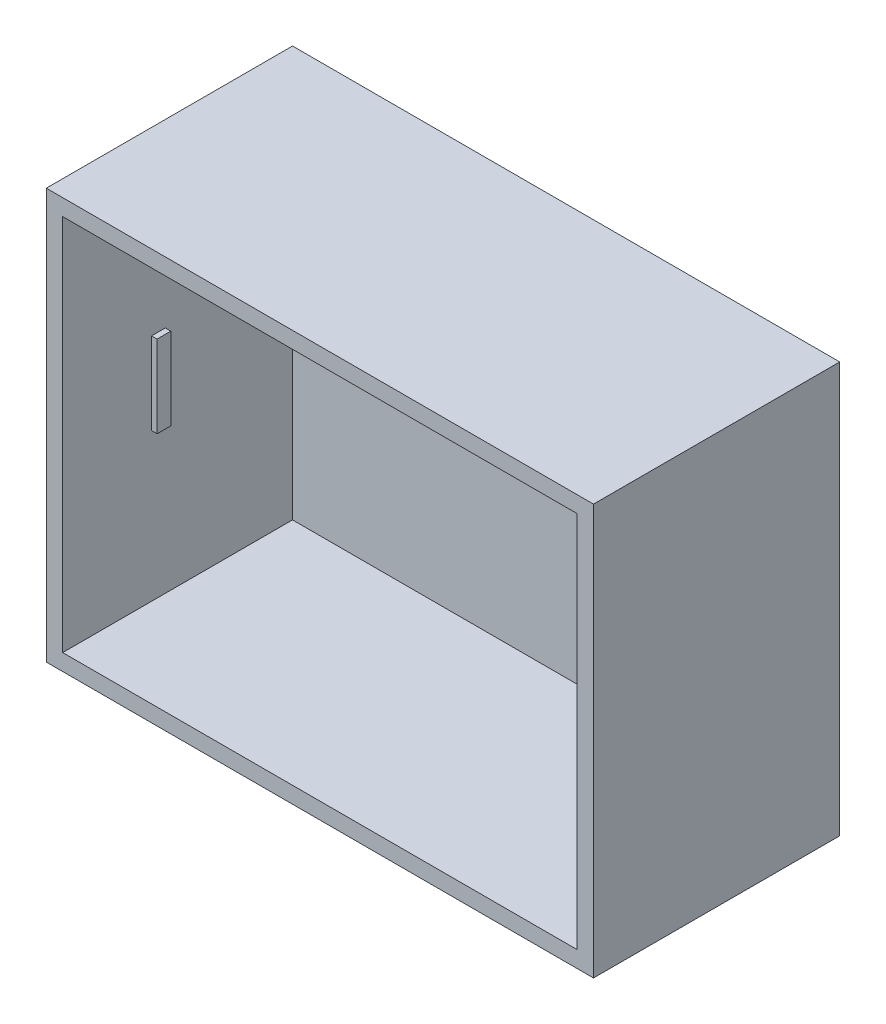
ISO-10303-21;
HEADER;
FILE_DESCRIPTION(('STEP AP214'),'2;1');
FILE_NAME('part.step','',(''),(''),'','','');
FILE_SCHEMA(('AUTOMOTIVE_DESIGN { 1 0 10303 214 1 1 1 1 }'));
ENDSEC;
DATA;
#1=APPLICATION_CONTEXT('core data for automotive mechanical design processes');
#2=APPLICATION_PROTOCOL_DEFINITION('international standard','automotive_design',2000,#1);
#3=PRODUCT_CONTEXT('',#1,'mechanical');
#4=PRODUCT('Part','Part','',(#3));
#5=PRODUCT_RELATED_PRODUCT_CATEGORY('part','',(#4));
#6=PRODUCT_DEFINITION_FORMATION('','',#4);
#7=PRODUCT_DEFINITION_CONTEXT('part definition',#1,'design');
#8=PRODUCT_DEFINITION('design','',#6,#7);
#9=PRODUCT_DEFINITION_SHAPE('','',#8);
#10=(LENGTH_UNIT() NAMED_UNIT(*) SI_UNIT(.MILLI.,.METRE.));
#11=(NAMED_UNIT(*) PLANE_ANGLE_UNIT() SI_UNIT($,.RADIAN.));
#12=(NAMED_UNIT(*) SI_UNIT($,.STERADIAN.) SOLID_ANGLE_UNIT());
#13=UNCERTAINTY_MEASURE_WITH_UNIT(LENGTH_MEASURE(1.E-05),#10,'distance_accuracy_value','');
#14=(GEOMETRIC_REPRESENTATION_CONTEXT(3) GLOBAL_UNCERTAINTY_ASSIGNED_CONTEXT((#13)) GLOBAL_UNIT_ASSIGNED_CONTEXT((#10,
#11,#12)) REPRESENTATION_CONTEXT('',''));
#15=CARTESIAN_POINT('',(0.,0.,0.));
#16=DIRECTION('',(0.,0.,1.));
#17=DIRECTION('',(1.,0.,0.));
#18=AXIS2_PLACEMENT_3D('',#15,#16,#17);
#19=CARTESIAN_POINT('',(37.6,-27.6,36.));
#20=DIRECTION('',(-1.,0.,0.));
#21=DIRECTION('',(0.,0.,1.));
#22=AXIS2_PLACEMENT_3D('',#19,#20,#21);
#23=PLANE('',#22);
#24=DIRECTION('',(0.,1.,0.));
#25=VECTOR('',#24,1.);
#26=CARTESIAN_POINT('',(37.6,-27.6,2.4));
#27=LINE('',#26,#25);
#28=CARTESIAN_POINT('',(37.6,-27.6,2.4));
#29=VERTEX_POINT('',#28);
#30=CARTESIAN_POINT('',(37.6,27.6,2.4));
#31=VERTEX_POINT('',#30);
#32=EDGE_CURVE('E254',#29,#31,#27,.T.);
#33=ORIENTED_EDGE('',*,*,#32,.F.);
#34=DIRECTION('',(0.,0.,-1.));
#35=VECTOR('',#34,1.);
#36=CARTESIAN_POINT('',(37.6,-27.6,36.));
#37=LINE('',#36,#35);
#38=CARTESIAN_POINT('',(37.6,-27.6,36.));
#39=VERTEX_POINT('',#38);
#40=EDGE_CURVE('E266',#39,#29,#37,.T.);
#41=ORIENTED_EDGE('',*,*,#40,.F.);
#42=DIRECTION('',(0.,1.,0.));
#43=VECTOR('',#42,1.);
#44=CARTESIAN_POINT('',(37.6,-27.6,36.));
#45=LINE('',#44,#43);
#46=CARTESIAN_POINT('',(37.6,27.6,36.));
#47=VERTEX_POINT('',#46);
#48=EDGE_CURVE('E239',#39,#47,#45,.T.);
#49=ORIENTED_EDGE('',*,*,#48,.T.);
#50=DIRECTION('',(0.,0.,-1.));
#51=VECTOR('',#50,1.);
#52=CARTESIAN_POINT('',(37.6,27.6,36.));
#53=LINE('',#52,#51);
#54=EDGE_CURVE('E263',#47,#31,#53,.T.);
#55=ORIENTED_EDGE('',*,*,#54,.T.);
#56=EDGE_LOOP('',(#33,#41,#49,#55));
#57=FACE_BOUND('',#56,.T.);
#58=DIRECTION('',(0.,0.,-1.));
#59=VECTOR('',#58,1.);
#60=CARTESIAN_POINT('',(37.6,6.,23.));
#61=LINE('',#60,#59);
#62=CARTESIAN_POINT('',(37.6,6.,23.));
#63=VERTEX_POINT('',#62);
#64=CARTESIAN_POINT('',(37.6,6.,21.));
#65=VERTEX_POINT('',#64);
#66=EDGE_CURVE('E66',#63,#65,#61,.T.);
#67=ORIENTED_EDGE('',*,*,#66,.F.);
#68=DIRECTION('',(0.,1.,0.));
#69=VECTOR('',#68,1.);
#70=CARTESIAN_POINT('',(37.6,-6.,23.));
#71=LINE('',#70,#69);
#72=CARTESIAN_POINT('',(37.6,-6.,23.));
#73=VERTEX_POINT('',#72);
#74=EDGE_CURVE('E61',#73,#63,#71,.T.);
#75=ORIENTED_EDGE('',*,*,#74,.F.);
#76=DIRECTION('',(0.,0.,-1.));
#77=VECTOR('',#76,1.);
#78=CARTESIAN_POINT('',(37.6,-6.,23.));
#79=LINE('',#78,#77);
#80=CARTESIAN_POINT('',(37.6,-6.,21.));
#81=VERTEX_POINT('',#80);
#82=EDGE_CURVE('E164',#73,#81,#79,.T.);
#83=ORIENTED_EDGE('',*,*,#82,.T.);
#84=DIRECTION('',(0.,1.,0.));
#85=VECTOR('',#84,1.);
#86=CARTESIAN_POINT('',(37.6,-6.,21.));
#87=LINE('',#86,#85);
#88=EDGE_CURVE('E498',#81,#65,#87,.T.);
#89=ORIENTED_EDGE('',*,*,#88,.T.);
#90=EDGE_LOOP('',(#67,#75,#83,#89));
#91=FACE_BOUND('',#90,.T.);
#92=ADVANCED_FACE('F45',(#57,#91),#23,.T.);
#93=CARTESIAN_POINT('',(-37.6,-27.6,36.));
#94=DIRECTION('',(1.,0.,0.));
#95=DIRECTION('',(0.,0.,-1.));
#96=AXIS2_PLACEMENT_3D('',#93,#94,#95);
#97=PLANE('',#96);
#98=DIRECTION('',(0.,-1.,0.));
#99=VECTOR('',#98,1.);
#100=CARTESIAN_POINT('',(-37.6,-27.6,2.4));
#101=LINE('',#100,#99);
#102=CARTESIAN_POINT('',(-37.6,27.6,2.4));
#103=VERTEX_POINT('',#102);
#104=CARTESIAN_POINT('',(-37.6,-27.6,2.4));
#105=VERTEX_POINT('',#104);
#106=EDGE_CURVE('E231',#103,#105,#101,.T.);
#107=ORIENTED_EDGE('',*,*,#106,.F.);
#108=DIRECTION('',(0.,0.,-1.));
#109=VECTOR('',#108,1.);
#110=CARTESIAN_POINT('',(-37.6,27.6,36.));
#111=LINE('',#110,#109);
#112=CARTESIAN_POINT('',(-37.6,27.6,36.));
#113=VERTEX_POINT('',#112);
#114=EDGE_CURVE('E246',#113,#103,#111,.T.);
#115=ORIENTED_EDGE('',*,*,#114,.F.);
#116=DIRECTION('',(0.,-1.,0.));
#117=VECTOR('',#116,1.);
#118=CARTESIAN_POINT('',(-37.6,-27.6,36.));
#119=LINE('',#118,#117);
#120=CARTESIAN_POINT('',(-37.6,-27.6,36.));
#121=VERTEX_POINT('',#120);
#122=EDGE_CURVE('E232',#113,#121,#119,.T.);
#123=ORIENTED_EDGE('',*,*,#122,.T.);
#124=DIRECTION('',(0.,0.,-1.));
#125=VECTOR('',#124,1.);
#126=CARTESIAN_POINT('',(-37.6,-27.6,36.));
#127=LINE('',#126,#125);
#128=EDGE_CURVE('E269',#121,#105,#127,.T.);
#129=ORIENTED_EDGE('',*,*,#128,.T.);
#130=EDGE_LOOP('',(#107,#115,#123,#129));
#131=FACE_BOUND('',#130,.T.);
#132=DIRECTION('',(0.,0.,-1.));
#133=VECTOR('',#132,1.);
#134=CARTESIAN_POINT('',(-37.6,-6.,23.));
#135=LINE('',#134,#133);
#136=CARTESIAN_POINT('',(-37.6,-6.,23.));
#137=VERTEX_POINT('',#136);
#138=CARTESIAN_POINT('',(-37.6,-6.,21.));
#139=VERTEX_POINT('',#138);
#140=EDGE_CURVE('E227',#137,#139,#135,.T.);
#141=ORIENTED_EDGE('',*,*,#140,.F.);
#142=DIRECTION('',(0.,-1.,0.));
#143=VECTOR('',#142,1.);
#144=CARTESIAN_POINT('',(-37.6,-6.,23.));
#145=LINE('',#144,#143);
#146=CARTESIAN_POINT('',(-37.6,6.,23.));
#147=VERTEX_POINT('',#146);
#148=EDGE_CURVE('E193',#147,#137,#145,.T.);
#149=ORIENTED_EDGE('',*,*,#148,.F.);
#150=DIRECTION('',(0.,0.,-1.));
#151=VECTOR('',#150,1.);
#152=CARTESIAN_POINT('',(-37.6,6.,23.));
#153=LINE('',#152,#151);
#154=CARTESIAN_POINT('',(-37.6,6.,21.));
#155=VERTEX_POINT('',#154);
#156=EDGE_CURVE('E207',#147,#155,#153,.T.);
#157=ORIENTED_EDGE('',*,*,#156,.T.);
#158=DIRECTION('',(0.,-1.,0.));
#159=VECTOR('',#158,1.);
#160=CARTESIAN_POINT('',(-37.6,-6.,21.));
#161=LINE('',#160,#159);
#162=EDGE_CURVE('E183',#155,#139,#161,.T.);
#163=ORIENTED_EDGE('',*,*,#162,.T.);
#164=EDGE_LOOP('',(#141,#149,#157,#163));
#165=FACE_BOUND('',#164,.T.);
#166=ADVANCED_FACE('F337',(#131,#165),#97,.T.);
#167=CARTESIAN_POINT('',(-40.,-30.,2.4));
#168=DIRECTION('',(1.,0.,0.));
#169=DIRECTION('',(0.,0.,-1.));
#170=AXIS2_PLACEMENT_3D('',#167,#168,#169);
#171=PLANE('',#170);
#172=DIRECTION('',(0.,-1.,0.));
#173=VECTOR('',#172,1.);
#174=CARTESIAN_POINT('',(-40.,-30.,0.));
#175=LINE('',#174,#173);
#176=CARTESIAN_POINT('',(-40.,30.,0.));
#177=VERTEX_POINT('',#176);
#178=CARTESIAN_POINT('',(-40.,-30.,0.));
#179=VERTEX_POINT('',#178);
#180=EDGE_CURVE('E289',#177,#179,#175,.T.);
#181=ORIENTED_EDGE('',*,*,#180,.T.);
#182=DIRECTION('',(0.,0.,-1.));
#183=VECTOR('',#182,1.);
#184=CARTESIAN_POINT('',(-40.,-30.,2.4));
#185=LINE('',#184,#183);
#186=CARTESIAN_POINT('',(-40.,-30.,36.));
#187=VERTEX_POINT('',#186);
#188=EDGE_CURVE('E11',#187,#179,#185,.T.);
#189=ORIENTED_EDGE('',*,*,#188,.F.);
#190=DIRECTION('',(0.,-1.,0.));
#191=VECTOR('',#190,1.);
#192=CARTESIAN_POINT('',(-40.,-30.,36.));
#193=LINE('',#192,#191);
#194=CARTESIAN_POINT('',(-40.,30.,36.));
#195=VERTEX_POINT('',#194);
#196=EDGE_CURVE('E273',#195,#187,#193,.T.);
#197=ORIENTED_EDGE('',*,*,#196,.F.);
#198=DIRECTION('',(0.,0.,-1.));
#199=VECTOR('',#198,1.);
#200=CARTESIAN_POINT('',(-40.,30.,2.4));
#201=LINE('',#200,#199);
#202=EDGE_CURVE('E302',#195,#177,#201,.T.);
#203=ORIENTED_EDGE('',*,*,#202,.T.);
#204=EDGE_LOOP('',(#181,#189,#197,#203));
#205=FACE_BOUND('',#204,.T.);
#206=ADVANCED_FACE('F47',(#205),#171,.F.);
#207=CARTESIAN_POINT('',(-40.,-30.,2.4));
#208=DIRECTION('',(0.,1.,0.));
#209=DIRECTION('',(0.,0.,1.));
#210=AXIS2_PLACEMENT_3D('',#207,#208,#209);
#211=PLANE('',#210);
#212=DIRECTION('',(1.,0.,0.));
#213=VECTOR('',#212,1.);
#214=CARTESIAN_POINT('',(-40.,-30.,0.));
#215=LINE('',#214,#213);
#216=CARTESIAN_POINT('',(40.,-30.,0.));
#217=VERTEX_POINT('',#216);
#218=EDGE_CURVE('E293',#179,#217,#215,.T.);
#219=ORIENTED_EDGE('',*,*,#218,.T.);
#220=DIRECTION('',(0.,0.,-1.));
#221=VECTOR('',#220,1.);
#222=CARTESIAN_POINT('',(40.,-30.,2.4));
#223=LINE('',#222,#221);
#224=CARTESIAN_POINT('',(40.,-30.,36.));
#225=VERTEX_POINT('',#224);
#226=EDGE_CURVE('E54',#225,#217,#223,.T.);
#227=ORIENTED_EDGE('',*,*,#226,.F.);
#228=DIRECTION('',(1.,0.,0.));
#229=VECTOR('',#228,1.);
#230=CARTESIAN_POINT('',(-40.,-30.,36.));
#231=LINE('',#230,#229);
#232=EDGE_CURVE('E277',#187,#225,#231,.T.);
#233=ORIENTED_EDGE('',*,*,#232,.F.);
#234=ORIENTED_EDGE('',*,*,#188,.T.);
#235=EDGE_LOOP('',(#219,#227,#233,#234));
#236=FACE_BOUND('',#235,.T.);
#237=ADVANCED_FACE('F330',(#236),#211,.F.);
#238=CARTESIAN_POINT('',(40.,-30.,2.4));
#239=DIRECTION('',(-1.,0.,0.));
#240=DIRECTION('',(0.,0.,1.));
#241=AXIS2_PLACEMENT_3D('',#238,#239,#240);
#242=PLANE('',#241);
#243=DIRECTION('',(0.,1.,0.));
#244=VECTOR('',#243,1.);
#245=CARTESIAN_POINT('',(40.,-30.,0.));
#246=LINE('',#245,#244);
#247=CARTESIAN_POINT('',(40.,30.,0.));
#248=VERTEX_POINT('',#247);
#249=EDGE_CURVE('E296',#217,#248,#246,.T.);
#250=ORIENTED_EDGE('',*,*,#249,.T.);
#251=DIRECTION('',(0.,0.,-1.));
#252=VECTOR('',#251,1.);
#253=CARTESIAN_POINT('',(40.,30.,2.4));
#254=LINE('',#253,#252);
#255=CARTESIAN_POINT('',(40.,30.,36.));
#256=VERTEX_POINT('',#255);
#257=EDGE_CURVE('E306',#256,#248,#254,.T.);
#258=ORIENTED_EDGE('',*,*,#257,.F.);
#259=DIRECTION('',(0.,1.,0.));
#260=VECTOR('',#259,1.);
#261=CARTESIAN_POINT('',(40.,-30.,36.));
#262=LINE('',#261,#260);
#263=EDGE_CURVE('E281',#225,#256,#262,.T.);
#264=ORIENTED_EDGE('',*,*,#263,.F.);
#265=ORIENTED_EDGE('',*,*,#226,.T.);
#266=EDGE_LOOP('',(#250,#258,#264,#265));
#267=FACE_BOUND('',#266,.T.);
#268=ADVANCED_FACE('F315',(#267),#242,.F.);
#269=CARTESIAN_POINT('',(-40.,30.,2.4));
#270=DIRECTION('',(0.,-1.,0.));
#271=DIRECTION('',(0.,0.,-1.));
#272=AXIS2_PLACEMENT_3D('',#269,#270,#271);
#273=PLANE('',#272);
#274=DIRECTION('',(-1.,0.,0.));
#275=VECTOR('',#274,1.);
#276=CARTESIAN_POINT('',(-40.,30.,0.));
#277=LINE('',#276,#275);
#278=EDGE_CURVE('E299',#248,#177,#277,.T.);
#279=ORIENTED_EDGE('',*,*,#278,.T.);
#280=ORIENTED_EDGE('',*,*,#202,.F.);
#281=DIRECTION('',(-1.,0.,0.));
#282=VECTOR('',#281,1.);
#283=CARTESIAN_POINT('',(-40.,30.,36.));
#284=LINE('',#283,#282);
#285=EDGE_CURVE('E285',#256,#195,#284,.T.);
#286=ORIENTED_EDGE('',*,*,#285,.F.);
#287=ORIENTED_EDGE('',*,*,#257,.T.);
#288=EDGE_LOOP('',(#279,#280,#286,#287));
#289=FACE_BOUND('',#288,.T.);
#290=ADVANCED_FACE('F323',(#289),#273,.F.);
#291=CARTESIAN_POINT('',(0.,0.,0.));
#292=DIRECTION('',(0.,0.,-1.));
#293=DIRECTION('',(-1.,0.,0.));
#294=AXIS2_PLACEMENT_3D('',#291,#292,#293);
#295=PLANE('',#294);
#296=ORIENTED_EDGE('',*,*,#180,.F.);
#297=ORIENTED_EDGE('',*,*,#278,.F.);
#298=ORIENTED_EDGE('',*,*,#249,.F.);
#299=ORIENTED_EDGE('',*,*,#218,.F.);
#300=EDGE_LOOP('',(#296,#297,#298,#299));
#301=FACE_BOUND('',#300,.T.);
#302=ADVANCED_FACE('F321',(#301),#295,.T.);
#303=CARTESIAN_POINT('',(0.,0.,36.));
#304=DIRECTION('',(0.,0.,-1.));
#305=DIRECTION('',(-1.,0.,0.));
#306=AXIS2_PLACEMENT_3D('',#303,#304,#305);
#307=PLANE('',#306);
#308=ORIENTED_EDGE('',*,*,#196,.T.);
#309=ORIENTED_EDGE('',*,*,#232,.T.);
#310=ORIENTED_EDGE('',*,*,#263,.T.);
#311=ORIENTED_EDGE('',*,*,#285,.T.);
#312=EDGE_LOOP('',(#308,#309,#310,#311));
#313=FACE_BOUND('',#312,.T.);
#314=ORIENTED_EDGE('',*,*,#122,.F.);
#315=DIRECTION('',(-1.,0.,0.));
#316=VECTOR('',#315,1.);
#317=CARTESIAN_POINT('',(-37.6,27.6,36.));
#318=LINE('',#317,#316);
#319=EDGE_CURVE('E243',#47,#113,#318,.T.);
#320=ORIENTED_EDGE('',*,*,#319,.F.);
#321=ORIENTED_EDGE('',*,*,#48,.F.);
#322=DIRECTION('',(1.,0.,0.));
#323=VECTOR('',#322,1.);
#324=CARTESIAN_POINT('',(-37.6,-27.6,36.));
#325=LINE('',#324,#323);
#326=EDGE_CURVE('E235',#121,#39,#325,.T.);
#327=ORIENTED_EDGE('',*,*,#326,.F.);
#328=EDGE_LOOP('',(#314,#320,#321,#327));
#329=FACE_BOUND('',#328,.T.);
#330=ADVANCED_FACE('F328',(#313,#329),#307,.F.);
#331=CARTESIAN_POINT('',(-37.6,-27.6,36.));
#332=DIRECTION('',(0.,1.,0.));
#333=DIRECTION('',(0.,0.,1.));
#334=AXIS2_PLACEMENT_3D('',#331,#332,#333);
#335=PLANE('',#334);
#336=DIRECTION('',(1.,0.,0.));
#337=VECTOR('',#336,1.);
#338=CARTESIAN_POINT('',(-37.6,-27.6,2.4));
#339=LINE('',#338,#337);
#340=EDGE_CURVE('E250',#105,#29,#339,.T.);
#341=ORIENTED_EDGE('',*,*,#340,.F.);
#342=ORIENTED_EDGE('',*,*,#128,.F.);
#343=ORIENTED_EDGE('',*,*,#326,.T.);
#344=ORIENTED_EDGE('',*,*,#40,.T.);
#345=EDGE_LOOP('',(#341,#342,#343,#344));
#346=FACE_BOUND('',#345,.T.);
#347=ADVANCED_FACE('F353',(#346),#335,.T.);
#348=CARTESIAN_POINT('',(-37.6,27.6,36.));
#349=DIRECTION('',(0.,-1.,0.));
#350=DIRECTION('',(0.,0.,-1.));
#351=AXIS2_PLACEMENT_3D('',#348,#349,#350);
#352=PLANE('',#351);
#353=DIRECTION('',(-1.,0.,0.));
#354=VECTOR('',#353,1.);
#355=CARTESIAN_POINT('',(-37.6,27.6,2.4));
#356=LINE('',#355,#354);
#357=EDGE_CURVE('E236',#31,#103,#356,.T.);
#358=ORIENTED_EDGE('',*,*,#357,.F.);
#359=ORIENTED_EDGE('',*,*,#54,.F.);
#360=ORIENTED_EDGE('',*,*,#319,.T.);
#361=ORIENTED_EDGE('',*,*,#114,.T.);
#362=EDGE_LOOP('',(#358,#359,#360,#361));
#363=FACE_BOUND('',#362,.T.);
#364=ADVANCED_FACE('F351',(#363),#352,.T.);
#365=CARTESIAN_POINT('',(0.,0.,2.4));
#366=DIRECTION('',(0.,0.,-1.));
#367=DIRECTION('',(-1.,0.,0.));
#368=AXIS2_PLACEMENT_3D('',#365,#366,#367);
#369=PLANE('',#368);
#370=ORIENTED_EDGE('',*,*,#357,.T.);
#371=ORIENTED_EDGE('',*,*,#106,.T.);
#372=ORIENTED_EDGE('',*,*,#340,.T.);
#373=ORIENTED_EDGE('',*,*,#32,.T.);
#374=EDGE_LOOP('',(#370,#371,#372,#373));
#375=FACE_BOUND('',#374,.T.);
#376=ADVANCED_FACE('F359',(#375),#369,.F.);
#377=CARTESIAN_POINT('',(-37.6,-6.,23.));
#378=DIRECTION('',(0.,1.,0.));
#379=DIRECTION('',(0.,0.,1.));
#380=AXIS2_PLACEMENT_3D('',#377,#378,#379);
#381=PLANE('',#380);
#382=DIRECTION('',(1.,0.,0.));
#383=VECTOR('',#382,1.);
#384=CARTESIAN_POINT('',(-37.6,-6.,21.));
#385=LINE('',#384,#383);
#386=CARTESIAN_POINT('',(-36.8,-6.,21.));
#387=VERTEX_POINT('',#386);
#388=EDGE_CURVE('E188',#139,#387,#385,.T.);
#389=ORIENTED_EDGE('',*,*,#388,.T.);
#390=DIRECTION('',(0.,0.,-1.));
#391=VECTOR('',#390,1.);
#392=CARTESIAN_POINT('',(-36.8,-6.,23.));
#393=LINE('',#392,#391);
#394=CARTESIAN_POINT('',(-36.8,-6.,23.));
#395=VERTEX_POINT('',#394);
#396=EDGE_CURVE('E223',#395,#387,#393,.T.);
#397=ORIENTED_EDGE('',*,*,#396,.F.);
#398=DIRECTION('',(1.,0.,0.));
#399=VECTOR('',#398,1.);
#400=CARTESIAN_POINT('',(-37.6,-6.,23.));
#401=LINE('',#400,#399);
#402=EDGE_CURVE('E197',#137,#395,#401,.T.);
#403=ORIENTED_EDGE('',*,*,#402,.F.);
#404=ORIENTED_EDGE('',*,*,#140,.T.);
#405=EDGE_LOOP('',(#389,#397,#403,#404));
#406=FACE_BOUND('',#405,.T.);
#407=ADVANCED_FACE('F362',(#406),#381,.F.);
#408=CARTESIAN_POINT('',(-36.8,-6.,23.));
#409=DIRECTION('',(-1.,0.,0.));
#410=DIRECTION('',(0.,0.,1.));
#411=AXIS2_PLACEMENT_3D('',#408,#409,#410);
#412=PLANE('',#411);
#413=DIRECTION('',(0.,1.,0.));
#414=VECTOR('',#413,1.);
#415=CARTESIAN_POINT('',(-36.8,-6.,21.));
#416=LINE('',#415,#414);
#417=CARTESIAN_POINT('',(-36.8,6.,21.));
#418=VERTEX_POINT('',#417);
#419=EDGE_CURVE('E211',#387,#418,#416,.T.);
#420=ORIENTED_EDGE('',*,*,#419,.T.);
#421=DIRECTION('',(0.,0.,-1.));
#422=VECTOR('',#421,1.);
#423=CARTESIAN_POINT('',(-36.8,6.,23.));
#424=LINE('',#423,#422);
#425=CARTESIAN_POINT('',(-36.8,6.,23.));
#426=VERTEX_POINT('',#425);
#427=EDGE_CURVE('E219',#426,#418,#424,.T.);
#428=ORIENTED_EDGE('',*,*,#427,.F.);
#429=DIRECTION('',(0.,1.,0.));
#430=VECTOR('',#429,1.);
#431=CARTESIAN_POINT('',(-36.8,-6.,23.));
#432=LINE('',#431,#430);
#433=EDGE_CURVE('E201',#395,#426,#432,.T.);
#434=ORIENTED_EDGE('',*,*,#433,.F.);
#435=ORIENTED_EDGE('',*,*,#396,.T.);
#436=EDGE_LOOP('',(#420,#428,#434,#435));
#437=FACE_BOUND('',#436,.T.);
#438=ADVANCED_FACE('F406',(#437),#412,.F.);
#439=CARTESIAN_POINT('',(-37.6,6.,23.));
#440=DIRECTION('',(0.,-1.,0.));
#441=DIRECTION('',(0.,0.,-1.));
#442=AXIS2_PLACEMENT_3D('',#439,#440,#441);
#443=PLANE('',#442);
#444=DIRECTION('',(-1.,0.,0.));
#445=VECTOR('',#444,1.);
#446=CARTESIAN_POINT('',(-37.6,6.,21.));
#447=LINE('',#446,#445);
#448=EDGE_CURVE('E198',#418,#155,#447,.T.);
#449=ORIENTED_EDGE('',*,*,#448,.T.);
#450=ORIENTED_EDGE('',*,*,#156,.F.);
#451=DIRECTION('',(-1.,0.,0.));
#452=VECTOR('',#451,1.);
#453=CARTESIAN_POINT('',(-37.6,6.,23.));
#454=LINE('',#453,#452);
#455=EDGE_CURVE('E204',#426,#147,#454,.T.);
#456=ORIENTED_EDGE('',*,*,#455,.F.);
#457=ORIENTED_EDGE('',*,*,#427,.T.);
#458=EDGE_LOOP('',(#449,#450,#456,#457));
#459=FACE_BOUND('',#458,.T.);
#460=ADVANCED_FACE('F413',(#459),#443,.F.);
#461=CARTESIAN_POINT('',(0.,0.,23.));
#462=DIRECTION('',(0.,0.,-1.));
#463=DIRECTION('',(-1.,0.,0.));
#464=AXIS2_PLACEMENT_3D('',#461,#462,#463);
#465=PLANE('',#464);
#466=ORIENTED_EDGE('',*,*,#148,.T.);
#467=ORIENTED_EDGE('',*,*,#402,.T.);
#468=ORIENTED_EDGE('',*,*,#433,.T.);
#469=ORIENTED_EDGE('',*,*,#455,.T.);
#470=EDGE_LOOP('',(#466,#467,#468,#469));
#471=FACE_BOUND('',#470,.T.);
#472=ADVANCED_FACE('F422',(#471),#465,.F.);
#473=CARTESIAN_POINT('',(0.,0.,21.));
#474=DIRECTION('',(0.,0.,-1.));
#475=DIRECTION('',(-1.,0.,0.));
#476=AXIS2_PLACEMENT_3D('',#473,#474,#475);
#477=PLANE('',#476);
#478=ORIENTED_EDGE('',*,*,#162,.F.);
#479=ORIENTED_EDGE('',*,*,#448,.F.);
#480=ORIENTED_EDGE('',*,*,#419,.F.);
#481=ORIENTED_EDGE('',*,*,#388,.F.);
#482=EDGE_LOOP('',(#478,#479,#480,#481));
#483=FACE_BOUND('',#482,.T.);
#484=ADVANCED_FACE('F430',(#483),#477,.T.);
#485=CARTESIAN_POINT('',(36.8,-6.,23.));
#486=DIRECTION('',(1.,0.,0.));
#487=DIRECTION('',(0.,0.,-1.));
#488=AXIS2_PLACEMENT_3D('',#485,#486,#487);
#489=PLANE('',#488);
#490=DIRECTION('',(0.,-1.,0.));
#491=VECTOR('',#490,1.);
#492=CARTESIAN_POINT('',(36.8,-6.,21.));
#493=LINE('',#492,#491);
#494=CARTESIAN_POINT('',(36.8,6.,21.));
#495=VERTEX_POINT('',#494);
#496=CARTESIAN_POINT('',(36.8,-6.,21.));
#497=VERTEX_POINT('',#496);
#498=EDGE_CURVE('E181',#495,#497,#493,.T.);
#499=ORIENTED_EDGE('',*,*,#498,.T.);
#500=DIRECTION('',(0.,0.,-1.));
#501=VECTOR('',#500,1.);
#502=CARTESIAN_POINT('',(36.8,-6.,23.));
#503=LINE('',#502,#501);
#504=CARTESIAN_POINT('',(36.8,-6.,23.));
#505=VERTEX_POINT('',#504);
#506=EDGE_CURVE('E162',#505,#497,#503,.T.);
#507=ORIENTED_EDGE('',*,*,#506,.F.);
#508=DIRECTION('',(0.,-1.,0.));
#509=VECTOR('',#508,1.);
#510=CARTESIAN_POINT('',(36.8,-6.,23.));
#511=LINE('',#510,#509);
#512=CARTESIAN_POINT('',(36.8,6.,23.));
#513=VERTEX_POINT('',#512);
#514=EDGE_CURVE('E167',#513,#505,#511,.T.);
#515=ORIENTED_EDGE('',*,*,#514,.F.);
#516=DIRECTION('',(0.,0.,-1.));
#517=VECTOR('',#516,1.);
#518=CARTESIAN_POINT('',(36.8,6.,23.));
#519=LINE('',#518,#517);
#520=EDGE_CURVE('E507',#513,#495,#519,.T.);
#521=ORIENTED_EDGE('',*,*,#520,.T.);
#522=EDGE_LOOP('',(#499,#507,#515,#521));
#523=FACE_BOUND('',#522,.T.);
#524=ADVANCED_FACE('F179',(#523),#489,.F.);
#525=CARTESIAN_POINT('',(36.8,-6.,23.));
#526=DIRECTION('',(0.,1.,0.));
#527=DIRECTION('',(0.,0.,1.));
#528=AXIS2_PLACEMENT_3D('',#525,#526,#527);
#529=PLANE('',#528);
#530=DIRECTION('',(1.,0.,0.));
#531=VECTOR('',#530,1.);
#532=CARTESIAN_POINT('',(36.8,-6.,21.));
#533=LINE('',#532,#531);
#534=EDGE_CURVE('E493',#497,#81,#533,.T.);
#535=ORIENTED_EDGE('',*,*,#534,.T.);
#536=ORIENTED_EDGE('',*,*,#82,.F.);
#537=DIRECTION('',(1.,0.,0.));
#538=VECTOR('',#537,1.);
#539=CARTESIAN_POINT('',(36.8,-6.,23.));
#540=LINE('',#539,#538);
#541=EDGE_CURVE('E157',#505,#73,#540,.T.);
#542=ORIENTED_EDGE('',*,*,#541,.F.);
#543=ORIENTED_EDGE('',*,*,#506,.T.);
#544=EDGE_LOOP('',(#535,#536,#542,#543));
#545=FACE_BOUND('',#544,.T.);
#546=ADVANCED_FACE('F160',(#545),#529,.F.);
#547=CARTESIAN_POINT('',(36.8,6.,23.));
#548=DIRECTION('',(0.,-1.,0.));
#549=DIRECTION('',(0.,0.,-1.));
#550=AXIS2_PLACEMENT_3D('',#547,#548,#549);
#551=PLANE('',#550);
#552=DIRECTION('',(-1.,0.,0.));
#553=VECTOR('',#552,1.);
#554=CARTESIAN_POINT('',(36.8,6.,21.));
#555=LINE('',#554,#553);
#556=EDGE_CURVE('E177',#65,#495,#555,.T.);
#557=ORIENTED_EDGE('',*,*,#556,.T.);
#558=ORIENTED_EDGE('',*,*,#520,.F.);
#559=DIRECTION('',(-1.,0.,0.));
#560=VECTOR('',#559,1.);
#561=CARTESIAN_POINT('',(36.8,6.,23.));
#562=LINE('',#561,#560);
#563=EDGE_CURVE('E172',#63,#513,#562,.T.);
#564=ORIENTED_EDGE('',*,*,#563,.F.);
#565=ORIENTED_EDGE('',*,*,#66,.T.);
#566=EDGE_LOOP('',(#557,#558,#564,#565));
#567=FACE_BOUND('',#566,.T.);
#568=ADVANCED_FACE('F461',(#567),#551,.F.);
#569=CARTESIAN_POINT('',(0.,0.,23.));
#570=DIRECTION('',(0.,0.,-1.));
#571=DIRECTION('',(-1.,0.,0.));
#572=AXIS2_PLACEMENT_3D('',#569,#570,#571);
#573=PLANE('',#572);
#574=ORIENTED_EDGE('',*,*,#514,.T.);
#575=ORIENTED_EDGE('',*,*,#541,.T.);
#576=ORIENTED_EDGE('',*,*,#74,.T.);
#577=ORIENTED_EDGE('',*,*,#563,.T.);
#578=EDGE_LOOP('',(#574,#575,#576,#577));
#579=FACE_BOUND('',#578,.T.);
#580=ADVANCED_FACE('F170',(#579),#573,.F.);
#581=CARTESIAN_POINT('',(0.,0.,21.));
#582=DIRECTION('',(0.,0.,-1.));
#583=DIRECTION('',(-1.,0.,0.));
#584=AXIS2_PLACEMENT_3D('',#581,#582,#583);
#585=PLANE('',#584);
#586=ORIENTED_EDGE('',*,*,#498,.F.);
#587=ORIENTED_EDGE('',*,*,#556,.F.);
#588=ORIENTED_EDGE('',*,*,#88,.F.);
#589=ORIENTED_EDGE('',*,*,#534,.F.);
#590=EDGE_LOOP('',(#586,#587,#588,#589));
#591=FACE_BOUND('',#590,.T.);
#592=ADVANCED_FACE('F479',(#591),#585,.T.);
#593=CLOSED_SHELL('',(#92,#166,#206,#237,#268,#290,#302,#330,#347,#364,#376,#407,#438,#460,#472,
#484,#524,#546,#568,#580,#592));
#594=MANIFOLD_SOLID_BREP('B2',#593);
#595=ADVANCED_BREP_SHAPE_REPRESENTATION('',(#18,#594),#14);
#596=SHAPE_DEFINITION_REPRESENTATION(#9,#595);
ENDSEC;
END-ISO-10303-21;
